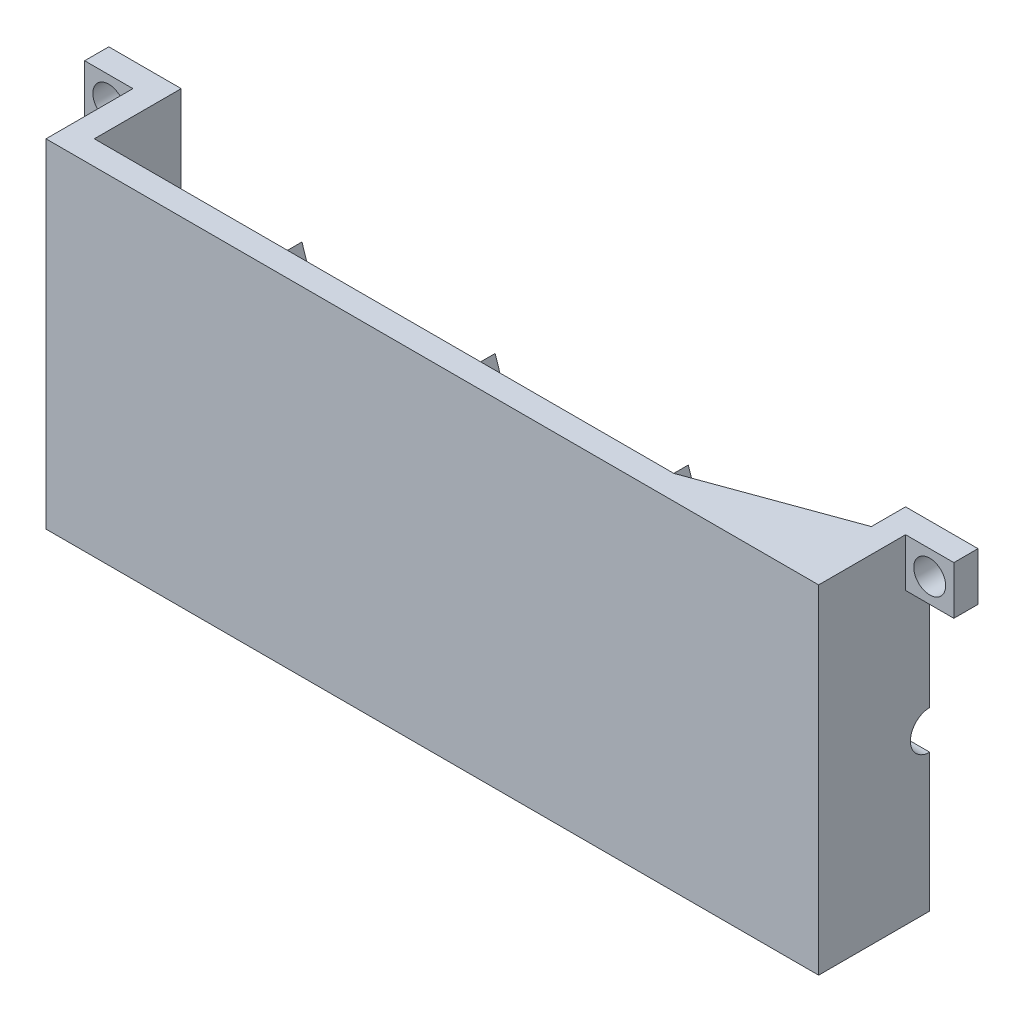
ISO-10303-21;
HEADER;
FILE_DESCRIPTION(('STEP AP214'),'2;1');
FILE_NAME('part.step','',(''),(''),'','','');
FILE_SCHEMA(('AUTOMOTIVE_DESIGN { 1 0 10303 214 1 1 1 1 }'));
ENDSEC;
DATA;
#1=APPLICATION_CONTEXT('core data for automotive mechanical design processes');
#2=APPLICATION_PROTOCOL_DEFINITION('international standard','automotive_design',2000,#1);
#3=PRODUCT_CONTEXT('',#1,'mechanical');
#4=PRODUCT('Part','Part','',(#3));
#5=PRODUCT_RELATED_PRODUCT_CATEGORY('part','',(#4));
#6=PRODUCT_DEFINITION_FORMATION('','',#4);
#7=PRODUCT_DEFINITION_CONTEXT('part definition',#1,'design');
#8=PRODUCT_DEFINITION('design','',#6,#7);
#9=PRODUCT_DEFINITION_SHAPE('','',#8);
#10=(LENGTH_UNIT() NAMED_UNIT(*) SI_UNIT(.MILLI.,.METRE.));
#11=(NAMED_UNIT(*) PLANE_ANGLE_UNIT() SI_UNIT($,.RADIAN.));
#12=(NAMED_UNIT(*) SI_UNIT($,.STERADIAN.) SOLID_ANGLE_UNIT());
#13=UNCERTAINTY_MEASURE_WITH_UNIT(LENGTH_MEASURE(1.E-05),#10,'distance_accuracy_value','');
#14=(GEOMETRIC_REPRESENTATION_CONTEXT(3) GLOBAL_UNCERTAINTY_ASSIGNED_CONTEXT((#13)) GLOBAL_UNIT_ASSIGNED_CONTEXT((#10,
#11,#12)) REPRESENTATION_CONTEXT('',''));
#15=CARTESIAN_POINT('',(0.,0.,0.));
#16=DIRECTION('',(0.,0.,1.));
#17=DIRECTION('',(1.,0.,0.));
#18=AXIS2_PLACEMENT_3D('',#15,#16,#17);
#19=CARTESIAN_POINT('',(0.,0.,63.5515463917525));
#20=DIRECTION('',(0.,0.,-1.));
#21=DIRECTION('',(-1.,0.,0.));
#22=AXIS2_PLACEMENT_3D('',#19,#20,#21);
#23=PLANE('',#22);
#24=DIRECTION('',(0.316227766016838,0.948683298050514,0.));
#25=VECTOR('',#24,1.);
#26=CARTESIAN_POINT('',(-11.6752577319588,5.00000000000001,63.5515463917525));
#27=LINE('',#26,#25);
#28=CARTESIAN_POINT('',(-7.25859106529209,18.25,63.5515463917525));
#29=VERTEX_POINT('',#28);
#30=CARTESIAN_POINT('',(-4.17525773195875,27.5,63.5515463917525));
#31=VERTEX_POINT('',#30);
#32=EDGE_CURVE('E298',#29,#31,#27,.T.);
#33=ORIENTED_EDGE('',*,*,#32,.T.);
#34=DIRECTION('',(0.316227766016838,-0.948683298050514,0.));
#35=VECTOR('',#34,1.);
#36=CARTESIAN_POINT('',(-4.17525773195875,27.5,63.5515463917525));
#37=LINE('',#36,#35);
#38=CARTESIAN_POINT('',(-1.09192439862542,18.25,63.5515463917525));
#39=VERTEX_POINT('',#38);
#40=EDGE_CURVE('E396',#31,#39,#37,.T.);
#41=ORIENTED_EDGE('',*,*,#40,.T.);
#42=DIRECTION('',(-1.,0.,0.));
#43=VECTOR('',#42,1.);
#44=CARTESIAN_POINT('',(45.,18.25,63.5515463917525));
#45=LINE('',#44,#43);
#46=EDGE_CURVE('E390',#29,#39,#45,.F.);
#47=ORIENTED_EDGE('',*,*,#46,.F.);
#48=EDGE_LOOP('',(#33,#41,#47));
#49=FACE_BOUND('',#48,.T.);
#50=ADVANCED_FACE('F34',(#49),#23,.T.);
#51=DIRECTION('',(0.316227766016838,0.948683298050514,0.));
#52=VECTOR('',#51,1.);
#53=CARTESIAN_POINT('',(8.32474226804124,5.00000000000001,63.5515463917525));
#54=LINE('',#53,#52);
#55=CARTESIAN_POINT('',(12.7414089347079,18.25,63.5515463917525));
#56=VERTEX_POINT('',#55);
#57=CARTESIAN_POINT('',(15.8247422680413,27.5,63.5515463917525));
#58=VERTEX_POINT('',#57);
#59=EDGE_CURVE('E403',#56,#58,#54,.T.);
#60=ORIENTED_EDGE('',*,*,#59,.T.);
#61=DIRECTION('',(0.316227766016838,-0.948683298050514,0.));
#62=VECTOR('',#61,1.);
#63=CARTESIAN_POINT('',(15.8247422680413,27.5,63.5515463917525));
#64=LINE('',#63,#62);
#65=CARTESIAN_POINT('',(18.9080756013746,18.25,63.5515463917525));
#66=VERTEX_POINT('',#65);
#67=EDGE_CURVE('E411',#58,#66,#64,.T.);
#68=ORIENTED_EDGE('',*,*,#67,.T.);
#69=DIRECTION('',(-1.,0.,0.));
#70=VECTOR('',#69,1.);
#71=CARTESIAN_POINT('',(45.,18.25,63.5515463917525));
#72=LINE('',#71,#70);
#73=EDGE_CURVE('E460',#56,#66,#72,.F.);
#74=ORIENTED_EDGE('',*,*,#73,.F.);
#75=EDGE_LOOP('',(#60,#68,#74));
#76=FACE_BOUND('',#75,.T.);
#77=ADVANCED_FACE('F640',(#76),#23,.T.);
#78=DIRECTION('',(0.316227766016838,0.948683298050514,0.));
#79=VECTOR('',#78,1.);
#80=CARTESIAN_POINT('',(-31.6752577319588,5.00000000000001,63.5515463917525));
#81=LINE('',#80,#79);
#82=CARTESIAN_POINT('',(-27.2585910652921,18.25,63.5515463917525));
#83=VERTEX_POINT('',#82);
#84=CARTESIAN_POINT('',(-24.1752577319588,27.5,63.5515463917525));
#85=VERTEX_POINT('',#84);
#86=EDGE_CURVE('E412',#83,#85,#81,.T.);
#87=ORIENTED_EDGE('',*,*,#86,.T.);
#88=DIRECTION('',(0.316227766016838,-0.948683298050514,0.));
#89=VECTOR('',#88,1.);
#90=CARTESIAN_POINT('',(-24.1752577319588,27.5,63.5515463917525));
#91=LINE('',#90,#89);
#92=CARTESIAN_POINT('',(-21.0919243986254,18.25,63.5515463917525));
#93=VERTEX_POINT('',#92);
#94=EDGE_CURVE('E419',#85,#93,#91,.T.);
#95=ORIENTED_EDGE('',*,*,#94,.T.);
#96=DIRECTION('',(-1.,0.,0.));
#97=VECTOR('',#96,1.);
#98=CARTESIAN_POINT('',(45.,18.25,63.5515463917525));
#99=LINE('',#98,#97);
#100=EDGE_CURVE('E464',#83,#93,#99,.F.);
#101=ORIENTED_EDGE('',*,*,#100,.F.);
#102=EDGE_LOOP('',(#87,#95,#101));
#103=FACE_BOUND('',#102,.T.);
#104=ADVANCED_FACE('F687',(#103),#23,.T.);
#105=CARTESIAN_POINT('',(-41.6752577319587,32.5,63.5515463917525));
#106=DIRECTION('',(0.,0.,-1.));
#107=DIRECTION('',(-1.,0.,0.));
#108=AXIS2_PLACEMENT_3D('',#105,#106,#107);
#109=CIRCLE('',#108,1.65);
#110=CARTESIAN_POINT('',(-43.3252577319587,32.5,63.5515463917525));
#111=VERTEX_POINT('',#110);
#112=EDGE_CURVE('E299',#111,#111,#109,.F.);
#113=ORIENTED_EDGE('',*,*,#112,.T.);
#114=EDGE_LOOP('',(#113));
#115=FACE_BOUND('',#114,.T.);
#116=DIRECTION('',(0.,1.,0.));
#117=VECTOR('',#116,1.);
#118=CARTESIAN_POINT('',(-39.1752577319587,35.,63.5515463917525));
#119=LINE('',#118,#117);
#120=CARTESIAN_POINT('',(-39.1752577319587,18.25,63.5515463917525));
#121=VERTEX_POINT('',#120);
#122=CARTESIAN_POINT('',(-39.1752577319587,30.,63.5515463917525));
#123=VERTEX_POINT('',#122);
#124=EDGE_CURVE('E279',#121,#123,#119,.T.);
#125=ORIENTED_EDGE('',*,*,#124,.T.);
#126=DIRECTION('',(-1.,0.,0.));
#127=VECTOR('',#126,1.);
#128=CARTESIAN_POINT('',(-44.1752577319587,30.,63.5515463917525));
#129=LINE('',#128,#127);
#130=CARTESIAN_POINT('',(-44.1752577319587,30.,63.5515463917525));
#131=VERTEX_POINT('',#130);
#132=EDGE_CURVE('E289',#123,#131,#129,.T.);
#133=ORIENTED_EDGE('',*,*,#132,.T.);
#134=DIRECTION('',(0.,-1.,0.));
#135=VECTOR('',#134,1.);
#136=CARTESIAN_POINT('',(-44.1752577319587,0.,63.5515463917525));
#137=LINE('',#136,#135);
#138=CARTESIAN_POINT('',(-44.1752577319587,35.,63.5515463917525));
#139=VERTEX_POINT('',#138);
#140=EDGE_CURVE('E447',#139,#131,#137,.T.);
#141=ORIENTED_EDGE('',*,*,#140,.F.);
#142=DIRECTION('',(1.,0.,0.));
#143=VECTOR('',#142,1.);
#144=CARTESIAN_POINT('',(0.,35.,63.5515463917525));
#145=LINE('',#144,#143);
#146=CARTESIAN_POINT('',(-36.6752577319588,35.,63.5515463917525));
#147=VERTEX_POINT('',#146);
#148=EDGE_CURVE('E294',#139,#147,#145,.T.);
#149=ORIENTED_EDGE('',*,*,#148,.T.);
#150=DIRECTION('',(0.,1.,0.));
#151=VECTOR('',#150,1.);
#152=CARTESIAN_POINT('',(-36.6752577319588,5.00000000000001,63.5515463917525));
#153=LINE('',#152,#151);
#154=CARTESIAN_POINT('',(-36.6752577319587,18.25,63.5515463917525));
#155=VERTEX_POINT('',#154);
#156=EDGE_CURVE('E446',#155,#147,#153,.T.);
#157=ORIENTED_EDGE('',*,*,#156,.F.);
#158=DIRECTION('',(-1.,0.,0.));
#159=VECTOR('',#158,1.);
#160=CARTESIAN_POINT('',(45.,18.25,63.5515463917525));
#161=LINE('',#160,#159);
#162=EDGE_CURVE('E292',#121,#155,#161,.F.);
#163=ORIENTED_EDGE('',*,*,#162,.F.);
#164=EDGE_LOOP('',(#125,#133,#141,#149,#157,#163));
#165=FACE_BOUND('',#164,.T.);
#166=ADVANCED_FACE('F288',(#115,#165),#23,.T.);
#167=DIRECTION('',(-1.,0.,0.));
#168=VECTOR('',#167,1.);
#169=CARTESIAN_POINT('',(-36.6752577319588,5.00000000000001,63.5515463917525));
#170=LINE('',#169,#168);
#171=CARTESIAN_POINT('',(-11.6752577319588,5.00000000000001,63.5515463917525));
#172=VERTEX_POINT('',#171);
#173=CARTESIAN_POINT('',(-16.6752577319588,5.00000000000001,63.5515463917525));
#174=VERTEX_POINT('',#173);
#175=EDGE_CURVE('E437',#172,#174,#170,.T.);
#176=ORIENTED_EDGE('',*,*,#175,.F.);
#177=CARTESIAN_POINT('',(-8.59192439862543,14.25,63.5515463917525));
#178=VERTEX_POINT('',#177);
#179=EDGE_CURVE('E302',#172,#178,#27,.T.);
#180=ORIENTED_EDGE('',*,*,#179,.T.);
#181=DIRECTION('',(-1.,0.,0.));
#182=VECTOR('',#181,1.);
#183=CARTESIAN_POINT('',(45.,14.25,63.5515463917525));
#184=LINE('',#183,#182);
#185=CARTESIAN_POINT('',(0.241408934707921,14.25,63.5515463917525));
#186=VERTEX_POINT('',#185);
#187=EDGE_CURVE('E388',#186,#178,#184,.T.);
#188=ORIENTED_EDGE('',*,*,#187,.F.);
#189=CARTESIAN_POINT('',(3.32474226804125,5.00000000000001,63.5515463917525));
#190=VERTEX_POINT('',#189);
#191=EDGE_CURVE('E398',#186,#190,#37,.T.);
#192=ORIENTED_EDGE('',*,*,#191,.T.);
#193=DIRECTION('',(-1.,0.,0.));
#194=VECTOR('',#193,1.);
#195=CARTESIAN_POINT('',(-36.6752577319588,5.00000000000001,63.5515463917525));
#196=LINE('',#195,#194);
#197=CARTESIAN_POINT('',(8.32474226804124,5.00000000000001,63.5515463917525));
#198=VERTEX_POINT('',#197);
#199=EDGE_CURVE('E435',#198,#190,#196,.T.);
#200=ORIENTED_EDGE('',*,*,#199,.F.);
#201=CARTESIAN_POINT('',(11.4080756013746,14.25,63.5515463917525));
#202=VERTEX_POINT('',#201);
#203=EDGE_CURVE('E407',#198,#202,#54,.T.);
#204=ORIENTED_EDGE('',*,*,#203,.T.);
#205=DIRECTION('',(-1.,0.,0.));
#206=VECTOR('',#205,1.);
#207=CARTESIAN_POINT('',(45.,14.25,63.5515463917525));
#208=LINE('',#207,#206);
#209=CARTESIAN_POINT('',(20.2414089347079,14.25,63.5515463917525));
#210=VERTEX_POINT('',#209);
#211=EDGE_CURVE('E458',#210,#202,#208,.T.);
#212=ORIENTED_EDGE('',*,*,#211,.F.);
#213=CARTESIAN_POINT('',(23.3247422680412,5.00000000000001,63.5515463917525));
#214=VERTEX_POINT('',#213);
#215=EDGE_CURVE('E408',#210,#214,#64,.T.);
#216=ORIENTED_EDGE('',*,*,#215,.T.);
#217=DIRECTION('',(-1.,0.,0.));
#218=VECTOR('',#217,1.);
#219=CARTESIAN_POINT('',(-36.6752577319588,5.00000000000001,63.5515463917525));
#220=LINE('',#219,#218);
#221=CARTESIAN_POINT('',(38.3247422680412,5.00000000000001,63.5515463917525));
#222=VERTEX_POINT('',#221);
#223=EDGE_CURVE('E429',#222,#214,#220,.T.);
#224=ORIENTED_EDGE('',*,*,#223,.F.);
#225=DIRECTION('',(0.,-1.,0.));
#226=VECTOR('',#225,1.);
#227=CARTESIAN_POINT('',(38.3247422680412,5.00000000000001,63.5515463917525));
#228=LINE('',#227,#226);
#229=CARTESIAN_POINT('',(38.3247422680412,14.25,63.5515463917525));
#230=VERTEX_POINT('',#229);
#231=EDGE_CURVE('E434',#230,#222,#228,.T.);
#232=ORIENTED_EDGE('',*,*,#231,.F.);
#233=DIRECTION('',(-1.,0.,0.));
#234=VECTOR('',#233,1.);
#235=CARTESIAN_POINT('',(45.,14.25,63.5515463917525));
#236=LINE('',#235,#234);
#237=CARTESIAN_POINT('',(40.8247422680413,14.25,63.5515463917525));
#238=VERTEX_POINT('',#237);
#239=EDGE_CURVE('E469',#238,#230,#236,.T.);
#240=ORIENTED_EDGE('',*,*,#239,.F.);
#241=DIRECTION('',(0.,1.,0.));
#242=VECTOR('',#241,1.);
#243=CARTESIAN_POINT('',(40.8247422680413,35.,63.5515463917525));
#244=LINE('',#243,#242);
#245=CARTESIAN_POINT('',(40.8247422680413,0.,63.5515463917525));
#246=VERTEX_POINT('',#245);
#247=EDGE_CURVE('E423',#246,#238,#244,.T.);
#248=ORIENTED_EDGE('',*,*,#247,.F.);
#249=DIRECTION('',(1.,0.,0.));
#250=VECTOR('',#249,1.);
#251=CARTESIAN_POINT('',(0.,0.,63.5515463917525));
#252=LINE('',#251,#250);
#253=CARTESIAN_POINT('',(-39.1752577319587,0.,63.5515463917525));
#254=VERTEX_POINT('',#253);
#255=EDGE_CURVE('E427',#254,#246,#252,.T.);
#256=ORIENTED_EDGE('',*,*,#255,.F.);
#257=CARTESIAN_POINT('',(-39.1752577319587,14.25,63.5515463917525));
#258=VERTEX_POINT('',#257);
#259=EDGE_CURVE('E293',#254,#258,#119,.T.);
#260=ORIENTED_EDGE('',*,*,#259,.T.);
#261=DIRECTION('',(-1.,0.,0.));
#262=VECTOR('',#261,1.);
#263=CARTESIAN_POINT('',(45.,14.25,63.5515463917525));
#264=LINE('',#263,#262);
#265=CARTESIAN_POINT('',(-36.6752577319587,14.25,63.5515463917525));
#266=VERTEX_POINT('',#265);
#267=EDGE_CURVE('E466',#266,#258,#264,.T.);
#268=ORIENTED_EDGE('',*,*,#267,.F.);
#269=CARTESIAN_POINT('',(-36.6752577319588,5.00000000000001,63.5515463917525));
#270=VERTEX_POINT('',#269);
#271=EDGE_CURVE('E443',#270,#266,#153,.T.);
#272=ORIENTED_EDGE('',*,*,#271,.F.);
#273=DIRECTION('',(-1.,0.,0.));
#274=VECTOR('',#273,1.);
#275=CARTESIAN_POINT('',(-36.6752577319588,5.00000000000001,63.5515463917525));
#276=LINE('',#275,#274);
#277=CARTESIAN_POINT('',(-31.6752577319588,5.00000000000001,63.5515463917525));
#278=VERTEX_POINT('',#277);
#279=EDGE_CURVE('E440',#278,#270,#276,.T.);
#280=ORIENTED_EDGE('',*,*,#279,.F.);
#281=CARTESIAN_POINT('',(-28.5919243986254,14.25,63.5515463917525));
#282=VERTEX_POINT('',#281);
#283=EDGE_CURVE('E415',#278,#282,#81,.T.);
#284=ORIENTED_EDGE('',*,*,#283,.T.);
#285=DIRECTION('',(-1.,0.,0.));
#286=VECTOR('',#285,1.);
#287=CARTESIAN_POINT('',(45.,14.25,63.5515463917525));
#288=LINE('',#287,#286);
#289=CARTESIAN_POINT('',(-19.7585910652921,14.25,63.5515463917525));
#290=VERTEX_POINT('',#289);
#291=EDGE_CURVE('E462',#290,#282,#288,.T.);
#292=ORIENTED_EDGE('',*,*,#291,.F.);
#293=EDGE_CURVE('E416',#290,#174,#91,.T.);
#294=ORIENTED_EDGE('',*,*,#293,.T.);
#295=EDGE_LOOP('',(#176,#180,#188,#192,#200,#204,#212,#216,#224,#232,#240,#248,#256,#260,#268,
#272,#280,#284,#292,#294));
#296=FACE_BOUND('',#295,.T.);
#297=ADVANCED_FACE('F544',(#296),#23,.T.);
#298=DIRECTION('',(1.,0.,0.));
#299=VECTOR('',#298,1.);
#300=CARTESIAN_POINT('',(45.8247422680413,30.,63.5515463917525));
#301=LINE('',#300,#299);
#302=CARTESIAN_POINT('',(40.8247422680413,30.,63.5515463917525));
#303=VERTEX_POINT('',#302);
#304=CARTESIAN_POINT('',(45.8247422680413,30.,63.5515463917525));
#305=VERTEX_POINT('',#304);
#306=EDGE_CURVE('E449',#303,#305,#301,.T.);
#307=ORIENTED_EDGE('',*,*,#306,.F.);
#308=CARTESIAN_POINT('',(40.8247422680413,18.25,63.5515463917525));
#309=VERTEX_POINT('',#308);
#310=EDGE_CURVE('E426',#309,#303,#244,.T.);
#311=ORIENTED_EDGE('',*,*,#310,.F.);
#312=DIRECTION('',(-1.,0.,0.));
#313=VECTOR('',#312,1.);
#314=CARTESIAN_POINT('',(45.,18.25,63.5515463917525));
#315=LINE('',#314,#313);
#316=CARTESIAN_POINT('',(38.3247422680412,18.25,63.5515463917525));
#317=VERTEX_POINT('',#316);
#318=EDGE_CURVE('E471',#317,#309,#315,.F.);
#319=ORIENTED_EDGE('',*,*,#318,.F.);
#320=CARTESIAN_POINT('',(38.3247422680412,35.,63.5515463917525));
#321=VERTEX_POINT('',#320);
#322=EDGE_CURVE('E431',#321,#317,#228,.T.);
#323=ORIENTED_EDGE('',*,*,#322,.F.);
#324=CARTESIAN_POINT('',(45.8247422680413,35.,63.5515463917525));
#325=VERTEX_POINT('',#324);
#326=EDGE_CURVE('E420',#321,#325,#145,.T.);
#327=ORIENTED_EDGE('',*,*,#326,.T.);
#328=DIRECTION('',(0.,1.,0.));
#329=VECTOR('',#328,1.);
#330=CARTESIAN_POINT('',(45.8247422680413,0.,63.5515463917525));
#331=LINE('',#330,#329);
#332=EDGE_CURVE('E451',#305,#325,#331,.T.);
#333=ORIENTED_EDGE('',*,*,#332,.F.);
#334=EDGE_LOOP('',(#307,#311,#319,#323,#327,#333));
#335=FACE_BOUND('',#334,.T.);
#336=CARTESIAN_POINT('',(43.3247422680413,32.5,63.5515463917525));
#337=DIRECTION('',(0.,0.,-1.));
#338=DIRECTION('',(-1.,0.,0.));
#339=AXIS2_PLACEMENT_3D('',#336,#337,#338);
#340=CIRCLE('',#339,1.65);
#341=CARTESIAN_POINT('',(41.6747422680413,32.5,63.5515463917525));
#342=VERTEX_POINT('',#341);
#343=EDGE_CURVE('E453',#342,#342,#340,.T.);
#344=ORIENTED_EDGE('',*,*,#343,.F.);
#345=EDGE_LOOP('',(#344));
#346=FACE_BOUND('',#345,.T.);
#347=ADVANCED_FACE('F552',(#335,#346),#23,.T.);
#348=CARTESIAN_POINT('',(-39.1752577319587,35.,75.0515463917525));
#349=DIRECTION('',(0.,0.,-1.));
#350=DIRECTION('',(-1.,0.,0.));
#351=AXIS2_PLACEMENT_3D('',#348,#349,#350);
#352=PLANE('',#351);
#353=DIRECTION('',(1.,0.,0.));
#354=VECTOR('',#353,1.);
#355=CARTESIAN_POINT('',(-39.1752577319587,0.,75.0515463917525));
#356=LINE('',#355,#354);
#357=CARTESIAN_POINT('',(-39.1752577319587,0.,75.0515463917525));
#358=VERTEX_POINT('',#357);
#359=CARTESIAN_POINT('',(40.8247422680413,0.,75.0515463917525));
#360=VERTEX_POINT('',#359);
#361=EDGE_CURVE('E316',#358,#360,#356,.T.);
#362=ORIENTED_EDGE('',*,*,#361,.T.);
#363=DIRECTION('',(0.,-1.,0.));
#364=VECTOR('',#363,1.);
#365=CARTESIAN_POINT('',(40.8247422680413,35.,75.0515463917525));
#366=LINE('',#365,#364);
#367=CARTESIAN_POINT('',(40.8247422680413,35.,75.0515463917525));
#368=VERTEX_POINT('',#367);
#369=EDGE_CURVE('E311',#368,#360,#366,.T.);
#370=ORIENTED_EDGE('',*,*,#369,.F.);
#371=DIRECTION('',(1.,0.,0.));
#372=VECTOR('',#371,1.);
#373=CARTESIAN_POINT('',(-39.1752577319587,35.,75.0515463917525));
#374=LINE('',#373,#372);
#375=CARTESIAN_POINT('',(-39.1752577319587,35.,75.0515463917525));
#376=VERTEX_POINT('',#375);
#377=EDGE_CURVE('E310',#376,#368,#374,.T.);
#378=ORIENTED_EDGE('',*,*,#377,.F.);
#379=DIRECTION('',(0.,-1.,0.));
#380=VECTOR('',#379,1.);
#381=CARTESIAN_POINT('',(-39.1752577319587,35.,75.0515463917525));
#382=LINE('',#381,#380);
#383=EDGE_CURVE('E473',#376,#358,#382,.T.);
#384=ORIENTED_EDGE('',*,*,#383,.T.);
#385=EDGE_LOOP('',(#362,#370,#378,#384));
#386=FACE_BOUND('',#385,.T.);
#387=ADVANCED_FACE('F536',(#386),#352,.F.);
#388=CARTESIAN_POINT('',(23.3247422680412,50.9626665871387,72.5515463917525));
#389=DIRECTION('',(0.342020143325663,0.,0.93969262078591));
#390=DIRECTION('',(0.93969262078591,0.,-0.342020143325663));
#391=AXIS2_PLACEMENT_3D('',#388,#389,#390);
#392=PLANE('',#391);
#393=DIRECTION('',(0.,-1.,0.));
#394=VECTOR('',#393,1.);
#395=CARTESIAN_POINT('',(23.3247422680412,50.9626665871387,72.5515463917525));
#396=LINE('',#395,#394);
#397=CARTESIAN_POINT('',(23.3247422680412,35.,72.5515463917525));
#398=VERTEX_POINT('',#397);
#399=CARTESIAN_POINT('',(23.3247422680412,5.00000000000001,72.5515463917525));
#400=VERTEX_POINT('',#399);
#401=EDGE_CURVE('E493',#398,#400,#396,.T.);
#402=ORIENTED_EDGE('',*,*,#401,.F.);
#403=DIRECTION('',(0.93969262078591,0.,-0.342020143325663));
#404=VECTOR('',#403,1.);
#405=CARTESIAN_POINT('',(23.3247422680412,35.,72.5515463917525));
#406=LINE('',#405,#404);
#407=CARTESIAN_POINT('',(38.3247422680412,35.,67.0919928777596));
#408=VERTEX_POINT('',#407);
#409=EDGE_CURVE('E498',#398,#408,#406,.T.);
#410=ORIENTED_EDGE('',*,*,#409,.T.);
#411=DIRECTION('',(0.,-1.,0.));
#412=VECTOR('',#411,1.);
#413=CARTESIAN_POINT('',(38.3247422680412,50.9626665871387,67.0919928777596));
#414=LINE('',#413,#412);
#415=CARTESIAN_POINT('',(38.3247422680412,5.00000000000001,67.0919928777596));
#416=VERTEX_POINT('',#415);
#417=EDGE_CURVE('E495',#408,#416,#414,.T.);
#418=ORIENTED_EDGE('',*,*,#417,.T.);
#419=DIRECTION('',(-0.93969262078591,0.,0.342020143325663));
#420=VECTOR('',#419,1.);
#421=CARTESIAN_POINT('',(23.3247422680412,5.00000000000001,72.5515463917525));
#422=LINE('',#421,#420);
#423=EDGE_CURVE('E490',#416,#400,#422,.T.);
#424=ORIENTED_EDGE('',*,*,#423,.T.);
#425=EDGE_LOOP('',(#402,#410,#418,#424));
#426=FACE_BOUND('',#425,.T.);
#427=ADVANCED_FACE('F581',(#426),#392,.F.);
#428=CARTESIAN_POINT('',(-36.6752577319588,5.00000000000001,60.5515463917525));
#429=DIRECTION('',(0.,1.,0.));
#430=DIRECTION('',(1.,0.,0.));
#431=AXIS2_PLACEMENT_3D('',#428,#429,#430);
#432=PLANE('',#431);
#433=DIRECTION('',(0.,0.,1.));
#434=VECTOR('',#433,1.);
#435=CARTESIAN_POINT('',(38.3247422680412,5.00000000000001,60.5515463917525));
#436=LINE('',#435,#434);
#437=EDGE_CURVE('E324',#222,#416,#436,.T.);
#438=ORIENTED_EDGE('',*,*,#437,.F.);
#439=ORIENTED_EDGE('',*,*,#223,.T.);
#440=DIRECTION('',(0.,0.,1.));
#441=VECTOR('',#440,1.);
#442=CARTESIAN_POINT('',(23.3247422680412,5.00000000000001,33.5099118257726));
#443=LINE('',#442,#441);
#444=EDGE_CURVE('E89',#214,#400,#443,.T.);
#445=ORIENTED_EDGE('',*,*,#444,.T.);
#446=ORIENTED_EDGE('',*,*,#423,.F.);
#447=EDGE_LOOP('',(#438,#439,#445,#446));
#448=FACE_BOUND('',#447,.T.);
#449=ADVANCED_FACE('F603',(#448),#432,.T.);
#450=DIRECTION('',(0.,0.,1.));
#451=VECTOR('',#450,1.);
#452=CARTESIAN_POINT('',(8.32474226804124,5.00000000000001,33.5099118257726));
#453=LINE('',#452,#451);
#454=CARTESIAN_POINT('',(8.32474226804124,5.00000000000001,72.5515463917525));
#455=VERTEX_POINT('',#454);
#456=EDGE_CURVE('E343',#198,#455,#453,.T.);
#457=ORIENTED_EDGE('',*,*,#456,.F.);
#458=ORIENTED_EDGE('',*,*,#199,.T.);
#459=DIRECTION('',(0.,0.,1.));
#460=VECTOR('',#459,1.);
#461=CARTESIAN_POINT('',(3.32474226804125,5.00000000000001,33.5099118257726));
#462=LINE('',#461,#460);
#463=CARTESIAN_POINT('',(3.32474226804125,5.00000000000001,72.5515463917525));
#464=VERTEX_POINT('',#463);
#465=EDGE_CURVE('E340',#190,#464,#462,.T.);
#466=ORIENTED_EDGE('',*,*,#465,.T.);
#467=DIRECTION('',(-1.,0.,0.));
#468=VECTOR('',#467,1.);
#469=CARTESIAN_POINT('',(-36.6752577319588,5.00000000000001,72.5515463917525));
#470=LINE('',#469,#468);
#471=EDGE_CURVE('E516',#455,#464,#470,.T.);
#472=ORIENTED_EDGE('',*,*,#471,.F.);
#473=EDGE_LOOP('',(#457,#458,#466,#472));
#474=FACE_BOUND('',#473,.T.);
#475=ADVANCED_FACE('F594',(#474),#432,.T.);
#476=CARTESIAN_POINT('',(-36.6752577319588,5.00000000000001,72.5515463917525));
#477=DIRECTION('',(0.,0.,1.));
#478=DIRECTION('',(1.,0.,0.));
#479=AXIS2_PLACEMENT_3D('',#476,#477,#478);
#480=PLANE('',#479);
#481=DIRECTION('',(0.316227766016838,-0.948683298050514,0.));
#482=VECTOR('',#481,1.);
#483=CARTESIAN_POINT('',(15.8247422680413,27.5,72.5515463917525));
#484=LINE('',#483,#482);
#485=CARTESIAN_POINT('',(15.8247422680413,27.5,72.5515463917525));
#486=VERTEX_POINT('',#485);
#487=EDGE_CURVE('E349',#486,#400,#484,.T.);
#488=ORIENTED_EDGE('',*,*,#487,.F.);
#489=DIRECTION('',(0.316227766016838,0.948683298050514,0.));
#490=VECTOR('',#489,1.);
#491=CARTESIAN_POINT('',(8.32474226804124,5.00000000000001,72.5515463917525));
#492=LINE('',#491,#490);
#493=EDGE_CURVE('E501',#455,#486,#492,.T.);
#494=ORIENTED_EDGE('',*,*,#493,.F.);
#495=ORIENTED_EDGE('',*,*,#471,.T.);
#496=DIRECTION('',(0.316227766016838,-0.948683298050514,0.));
#497=VECTOR('',#496,1.);
#498=CARTESIAN_POINT('',(-4.17525773195875,27.5,72.5515463917525));
#499=LINE('',#498,#497);
#500=CARTESIAN_POINT('',(-4.17525773195875,27.5,72.5515463917525));
#501=VERTEX_POINT('',#500);
#502=EDGE_CURVE('E342',#501,#464,#499,.T.);
#503=ORIENTED_EDGE('',*,*,#502,.F.);
#504=DIRECTION('',(0.316227766016838,0.948683298050514,0.));
#505=VECTOR('',#504,1.);
#506=CARTESIAN_POINT('',(-11.6752577319588,5.00000000000001,72.5515463917525));
#507=LINE('',#506,#505);
#508=CARTESIAN_POINT('',(-11.6752577319588,5.00000000000001,72.5515463917525));
#509=VERTEX_POINT('',#508);
#510=EDGE_CURVE('E346',#509,#501,#507,.T.);
#511=ORIENTED_EDGE('',*,*,#510,.F.);
#512=CARTESIAN_POINT('',(-16.6752577319588,5.00000000000001,72.5515463917525));
#513=VERTEX_POINT('',#512);
#514=EDGE_CURVE('E513',#509,#513,#470,.T.);
#515=ORIENTED_EDGE('',*,*,#514,.T.);
#516=DIRECTION('',(0.316227766016838,-0.948683298050514,0.));
#517=VECTOR('',#516,1.);
#518=CARTESIAN_POINT('',(-24.1752577319588,27.5,72.5515463917525));
#519=LINE('',#518,#517);
#520=CARTESIAN_POINT('',(-24.1752577319588,27.5,72.5515463917525));
#521=VERTEX_POINT('',#520);
#522=EDGE_CURVE('E334',#521,#513,#519,.T.);
#523=ORIENTED_EDGE('',*,*,#522,.F.);
#524=DIRECTION('',(0.316227766016838,0.948683298050514,0.));
#525=VECTOR('',#524,1.);
#526=CARTESIAN_POINT('',(-31.6752577319588,5.00000000000001,72.5515463917525));
#527=LINE('',#526,#525);
#528=CARTESIAN_POINT('',(-31.6752577319588,5.00000000000001,72.5515463917525));
#529=VERTEX_POINT('',#528);
#530=EDGE_CURVE('E338',#529,#521,#527,.T.);
#531=ORIENTED_EDGE('',*,*,#530,.F.);
#532=CARTESIAN_POINT('',(-36.6752577319588,5.00000000000001,72.5515463917525));
#533=VERTEX_POINT('',#532);
#534=EDGE_CURVE('E330',#529,#533,#470,.T.);
#535=ORIENTED_EDGE('',*,*,#534,.T.);
#536=DIRECTION('',(0.,1.,0.));
#537=VECTOR('',#536,1.);
#538=CARTESIAN_POINT('',(-36.6752577319588,5.00000000000001,72.5515463917525));
#539=LINE('',#538,#537);
#540=CARTESIAN_POINT('',(-36.6752577319588,35.,72.5515463917525));
#541=VERTEX_POINT('',#540);
#542=EDGE_CURVE('E517',#533,#541,#539,.T.);
#543=ORIENTED_EDGE('',*,*,#542,.T.);
#544=DIRECTION('',(1.,0.,0.));
#545=VECTOR('',#544,1.);
#546=CARTESIAN_POINT('',(-36.6752577319588,35.,72.5515463917525));
#547=LINE('',#546,#545);
#548=EDGE_CURVE('E326',#541,#398,#547,.T.);
#549=ORIENTED_EDGE('',*,*,#548,.T.);
#550=ORIENTED_EDGE('',*,*,#401,.T.);
#551=EDGE_LOOP('',(#488,#494,#495,#503,#511,#515,#523,#531,#535,#543,#549,#550));
#552=FACE_BOUND('',#551,.T.);
#553=ADVANCED_FACE('F577',(#552),#480,.F.);
#554=DIRECTION('',(0.,0.,1.));
#555=VECTOR('',#554,1.);
#556=CARTESIAN_POINT('',(-11.6752577319588,5.00000000000001,33.5099118257726));
#557=LINE('',#556,#555);
#558=EDGE_CURVE('E335',#172,#509,#557,.T.);
#559=ORIENTED_EDGE('',*,*,#558,.F.);
#560=ORIENTED_EDGE('',*,*,#175,.T.);
#561=DIRECTION('',(0.,0.,1.));
#562=VECTOR('',#561,1.);
#563=CARTESIAN_POINT('',(-16.6752577319588,5.00000000000001,33.5099118257726));
#564=LINE('',#563,#562);
#565=EDGE_CURVE('E332',#174,#513,#564,.T.);
#566=ORIENTED_EDGE('',*,*,#565,.T.);
#567=ORIENTED_EDGE('',*,*,#514,.F.);
#568=EDGE_LOOP('',(#559,#560,#566,#567));
#569=FACE_BOUND('',#568,.T.);
#570=ADVANCED_FACE('F628',(#569),#432,.T.);
#571=CARTESIAN_POINT('',(-11.6752577319588,5.00000000000001,33.5099118257726));
#572=DIRECTION('',(0.948683298050514,-0.316227766016838,0.));
#573=DIRECTION('',(-0.316227766016838,-0.948683298050514,0.));
#574=AXIS2_PLACEMENT_3D('',#571,#572,#573);
#575=PLANE('',#574);
#576=ORIENTED_EDGE('',*,*,#179,.F.);
#577=ORIENTED_EDGE('',*,*,#558,.T.);
#578=ORIENTED_EDGE('',*,*,#510,.T.);
#579=DIRECTION('',(0.,0.,1.));
#580=VECTOR('',#579,1.);
#581=CARTESIAN_POINT('',(-4.17525773195875,27.5,33.5099118257726));
#582=LINE('',#581,#580);
#583=EDGE_CURVE('E337',#31,#501,#582,.T.);
#584=ORIENTED_EDGE('',*,*,#583,.F.);
#585=ORIENTED_EDGE('',*,*,#32,.F.);
#586=CARTESIAN_POINT('',(-7.92525773195876,16.25,63.5515463917525));
#587=DIRECTION('',(0.948683298050514,-0.316227766016838,0.));
#588=DIRECTION('',(-0.316227766016838,-0.948683298050514,0.));
#589=AXIS2_PLACEMENT_3D('',#586,#587,#588);
#590=ELLIPSE('',#589,2.10818510677892,2.);
#591=EDGE_CURVE('E11',#178,#29,#590,.F.);
#592=ORIENTED_EDGE('',*,*,#591,.F.);
#593=EDGE_LOOP('',(#576,#577,#578,#584,#585,#592));
#594=FACE_BOUND('',#593,.T.);
#595=ADVANCED_FACE('F672',(#594),#575,.F.);
#596=CARTESIAN_POINT('',(-4.17525773195875,27.5,33.5099118257726));
#597=DIRECTION('',(-0.948683298050514,-0.316227766016838,0.));
#598=DIRECTION('',(-0.316227766016838,0.948683298050514,0.));
#599=AXIS2_PLACEMENT_3D('',#596,#597,#598);
#600=PLANE('',#599);
#601=ORIENTED_EDGE('',*,*,#40,.F.);
#602=ORIENTED_EDGE('',*,*,#583,.T.);
#603=ORIENTED_EDGE('',*,*,#502,.T.);
#604=ORIENTED_EDGE('',*,*,#465,.F.);
#605=ORIENTED_EDGE('',*,*,#191,.F.);
#606=CARTESIAN_POINT('',(-0.425257731958749,16.25,63.5515463917525));
#607=DIRECTION('',(-0.948683298050514,-0.316227766016838,0.));
#608=DIRECTION('',(-0.316227766016838,0.948683298050514,0.));
#609=AXIS2_PLACEMENT_3D('',#606,#607,#608);
#610=ELLIPSE('',#609,2.10818510677892,2.);
#611=EDGE_CURVE('E43',#39,#186,#610,.F.);
#612=ORIENTED_EDGE('',*,*,#611,.F.);
#613=EDGE_LOOP('',(#601,#602,#603,#604,#605,#612));
#614=FACE_BOUND('',#613,.T.);
#615=ADVANCED_FACE('F395',(#614),#600,.F.);
#616=CARTESIAN_POINT('',(45.,16.25,63.5515463917525));
#617=DIRECTION('',(-1.,0.,0.));
#618=DIRECTION('',(0.,0.,1.));
#619=AXIS2_PLACEMENT_3D('',#616,#617,#618);
#620=CYLINDRICAL_SURFACE('',#619,2.);
#621=ORIENTED_EDGE('',*,*,#611,.T.);
#622=ORIENTED_EDGE('',*,*,#187,.T.);
#623=ORIENTED_EDGE('',*,*,#591,.T.);
#624=ORIENTED_EDGE('',*,*,#46,.T.);
#625=EDGE_LOOP('',(#621,#622,#623,#624));
#626=FACE_BOUND('',#625,.T.);
#627=ADVANCED_FACE('F36',(#626),#620,.F.);
#628=CARTESIAN_POINT('',(8.32474226804124,5.00000000000001,33.5099118257726));
#629=DIRECTION('',(0.948683298050514,-0.316227766016838,0.));
#630=DIRECTION('',(-0.316227766016838,-0.948683298050514,0.));
#631=AXIS2_PLACEMENT_3D('',#628,#629,#630);
#632=PLANE('',#631);
#633=ORIENTED_EDGE('',*,*,#203,.F.);
#634=ORIENTED_EDGE('',*,*,#456,.T.);
#635=ORIENTED_EDGE('',*,*,#493,.T.);
#636=DIRECTION('',(0.,0.,1.));
#637=VECTOR('',#636,1.);
#638=CARTESIAN_POINT('',(15.8247422680413,27.5,33.5099118257726));
#639=LINE('',#638,#637);
#640=EDGE_CURVE('E345',#58,#486,#639,.T.);
#641=ORIENTED_EDGE('',*,*,#640,.F.);
#642=ORIENTED_EDGE('',*,*,#59,.F.);
#643=CARTESIAN_POINT('',(12.0747422680412,16.25,63.5515463917525));
#644=DIRECTION('',(0.948683298050514,-0.316227766016838,0.));
#645=DIRECTION('',(-0.316227766016838,-0.948683298050514,0.));
#646=AXIS2_PLACEMENT_3D('',#643,#644,#645);
#647=ELLIPSE('',#646,2.10818510677892,2.);
#648=EDGE_CURVE('E383',#202,#56,#647,.F.);
#649=ORIENTED_EDGE('',*,*,#648,.F.);
#650=EDGE_LOOP('',(#633,#634,#635,#641,#642,#649));
#651=FACE_BOUND('',#650,.T.);
#652=ADVANCED_FACE('F588',(#651),#632,.F.);
#653=CARTESIAN_POINT('',(15.8247422680413,27.5,33.5099118257726));
#654=DIRECTION('',(-0.948683298050514,-0.316227766016838,0.));
#655=DIRECTION('',(-0.316227766016838,0.948683298050514,0.));
#656=AXIS2_PLACEMENT_3D('',#653,#654,#655);
#657=PLANE('',#656);
#658=ORIENTED_EDGE('',*,*,#67,.F.);
#659=ORIENTED_EDGE('',*,*,#640,.T.);
#660=ORIENTED_EDGE('',*,*,#487,.T.);
#661=ORIENTED_EDGE('',*,*,#444,.F.);
#662=ORIENTED_EDGE('',*,*,#215,.F.);
#663=CARTESIAN_POINT('',(19.5747422680413,16.25,63.5515463917525));
#664=DIRECTION('',(-0.948683298050514,-0.316227766016838,0.));
#665=DIRECTION('',(-0.316227766016838,0.948683298050514,0.));
#666=AXIS2_PLACEMENT_3D('',#663,#664,#665);
#667=ELLIPSE('',#666,2.10818510677892,2.);
#668=EDGE_CURVE('E380',#66,#210,#667,.F.);
#669=ORIENTED_EDGE('',*,*,#668,.F.);
#670=EDGE_LOOP('',(#658,#659,#660,#661,#662,#669));
#671=FACE_BOUND('',#670,.T.);
#672=ADVANCED_FACE('F600',(#671),#657,.F.);
#673=ORIENTED_EDGE('',*,*,#668,.T.);
#674=ORIENTED_EDGE('',*,*,#211,.T.);
#675=ORIENTED_EDGE('',*,*,#648,.T.);
#676=ORIENTED_EDGE('',*,*,#73,.T.);
#677=EDGE_LOOP('',(#673,#674,#675,#676));
#678=FACE_BOUND('',#677,.T.);
#679=ADVANCED_FACE('F597',(#678),#620,.F.);
#680=DIRECTION('',(0.,0.,1.));
#681=VECTOR('',#680,1.);
#682=CARTESIAN_POINT('',(-31.6752577319588,5.00000000000001,33.5099118257726));
#683=LINE('',#682,#681);
#684=EDGE_CURVE('E327',#278,#529,#683,.T.);
#685=ORIENTED_EDGE('',*,*,#684,.F.);
#686=ORIENTED_EDGE('',*,*,#279,.T.);
#687=DIRECTION('',(0.,0.,1.));
#688=VECTOR('',#687,1.);
#689=CARTESIAN_POINT('',(-36.6752577319588,5.00000000000001,60.5515463917525));
#690=LINE('',#689,#688);
#691=EDGE_CURVE('E319',#270,#533,#690,.T.);
#692=ORIENTED_EDGE('',*,*,#691,.T.);
#693=ORIENTED_EDGE('',*,*,#534,.F.);
#694=EDGE_LOOP('',(#685,#686,#692,#693));
#695=FACE_BOUND('',#694,.T.);
#696=ADVANCED_FACE('F653',(#695),#432,.T.);
#697=CARTESIAN_POINT('',(-31.6752577319588,5.00000000000001,33.5099118257726));
#698=DIRECTION('',(0.948683298050514,-0.316227766016838,0.));
#699=DIRECTION('',(-0.316227766016838,-0.948683298050514,0.));
#700=AXIS2_PLACEMENT_3D('',#697,#698,#699);
#701=PLANE('',#700);
#702=ORIENTED_EDGE('',*,*,#283,.F.);
#703=ORIENTED_EDGE('',*,*,#684,.T.);
#704=ORIENTED_EDGE('',*,*,#530,.T.);
#705=DIRECTION('',(0.,0.,1.));
#706=VECTOR('',#705,1.);
#707=CARTESIAN_POINT('',(-24.1752577319588,27.5,33.5099118257726));
#708=LINE('',#707,#706);
#709=EDGE_CURVE('E329',#85,#521,#708,.T.);
#710=ORIENTED_EDGE('',*,*,#709,.F.);
#711=ORIENTED_EDGE('',*,*,#86,.F.);
#712=CARTESIAN_POINT('',(-27.9252577319588,16.25,63.5515463917525));
#713=DIRECTION('',(0.948683298050514,-0.316227766016838,0.));
#714=DIRECTION('',(-0.316227766016838,-0.948683298050514,0.));
#715=AXIS2_PLACEMENT_3D('',#712,#713,#714);
#716=ELLIPSE('',#715,2.10818510677892,2.);
#717=EDGE_CURVE('E377',#282,#83,#716,.F.);
#718=ORIENTED_EDGE('',*,*,#717,.F.);
#719=EDGE_LOOP('',(#702,#703,#704,#710,#711,#718));
#720=FACE_BOUND('',#719,.T.);
#721=ADVANCED_FACE('F661',(#720),#701,.F.);
#722=CARTESIAN_POINT('',(-24.1752577319588,27.5,33.5099118257726));
#723=DIRECTION('',(-0.948683298050514,-0.316227766016838,0.));
#724=DIRECTION('',(-0.316227766016838,0.948683298050514,0.));
#725=AXIS2_PLACEMENT_3D('',#722,#723,#724);
#726=PLANE('',#725);
#727=ORIENTED_EDGE('',*,*,#94,.F.);
#728=ORIENTED_EDGE('',*,*,#709,.T.);
#729=ORIENTED_EDGE('',*,*,#522,.T.);
#730=ORIENTED_EDGE('',*,*,#565,.F.);
#731=ORIENTED_EDGE('',*,*,#293,.F.);
#732=CARTESIAN_POINT('',(-20.4252577319587,16.25,63.5515463917525));
#733=DIRECTION('',(-0.948683298050514,-0.316227766016838,0.));
#734=DIRECTION('',(-0.316227766016838,0.948683298050514,0.));
#735=AXIS2_PLACEMENT_3D('',#732,#733,#734);
#736=ELLIPSE('',#735,2.10818510677892,2.);
#737=EDGE_CURVE('E374',#93,#290,#736,.F.);
#738=ORIENTED_EDGE('',*,*,#737,.F.);
#739=EDGE_LOOP('',(#727,#728,#729,#730,#731,#738));
#740=FACE_BOUND('',#739,.T.);
#741=ADVANCED_FACE('F658',(#740),#726,.F.);
#742=ORIENTED_EDGE('',*,*,#737,.T.);
#743=ORIENTED_EDGE('',*,*,#291,.T.);
#744=ORIENTED_EDGE('',*,*,#717,.T.);
#745=ORIENTED_EDGE('',*,*,#100,.T.);
#746=EDGE_LOOP('',(#742,#743,#744,#745));
#747=FACE_BOUND('',#746,.T.);
#748=ADVANCED_FACE('F646',(#747),#620,.F.);
#749=CARTESIAN_POINT('',(-39.1752577319587,35.,52.0515463917525));
#750=DIRECTION('',(1.,0.,0.));
#751=DIRECTION('',(0.,0.,-1.));
#752=AXIS2_PLACEMENT_3D('',#749,#750,#751);
#753=PLANE('',#752);
#754=ORIENTED_EDGE('',*,*,#259,.F.);
#755=DIRECTION('',(0.,0.,1.));
#756=VECTOR('',#755,1.);
#757=CARTESIAN_POINT('',(-39.1752577319587,0.,52.0515463917525));
#758=LINE('',#757,#756);
#759=EDGE_CURVE('E314',#254,#358,#758,.T.);
#760=ORIENTED_EDGE('',*,*,#759,.T.);
#761=ORIENTED_EDGE('',*,*,#383,.F.);
#762=DIRECTION('',(0.,0.,1.));
#763=VECTOR('',#762,1.);
#764=CARTESIAN_POINT('',(-39.1752577319587,35.,52.0515463917525));
#765=LINE('',#764,#763);
#766=CARTESIAN_POINT('',(-39.1752577319587,35.,66.0515463917526));
#767=VERTEX_POINT('',#766);
#768=EDGE_CURVE('E308',#767,#376,#765,.T.);
#769=ORIENTED_EDGE('',*,*,#768,.F.);
#770=DIRECTION('',(0.,1.,0.));
#771=VECTOR('',#770,1.);
#772=CARTESIAN_POINT('',(-39.1752577319587,35.,66.0515463917526));
#773=LINE('',#772,#771);
#774=CARTESIAN_POINT('',(-39.1752577319587,30.,66.0515463917526));
#775=VERTEX_POINT('',#774);
#776=EDGE_CURVE('E282',#775,#767,#773,.T.);
#777=ORIENTED_EDGE('',*,*,#776,.F.);
#778=DIRECTION('',(0.,0.,1.));
#779=VECTOR('',#778,1.);
#780=CARTESIAN_POINT('',(-39.1752577319587,30.,61.0515463917525));
#781=LINE('',#780,#779);
#782=EDGE_CURVE('E70',#123,#775,#781,.T.);
#783=ORIENTED_EDGE('',*,*,#782,.F.);
#784=ORIENTED_EDGE('',*,*,#124,.F.);
#785=CARTESIAN_POINT('',(-39.1752577319587,16.25,63.5515463917525));
#786=DIRECTION('',(1.,0.,0.));
#787=DIRECTION('',(0.,0.,-1.));
#788=AXIS2_PLACEMENT_3D('',#785,#786,#787);
#789=CIRCLE('',#788,2.);
#790=EDGE_CURVE('E365',#258,#121,#789,.F.);
#791=ORIENTED_EDGE('',*,*,#790,.F.);
#792=EDGE_LOOP('',(#754,#760,#761,#769,#777,#783,#784,#791));
#793=FACE_BOUND('',#792,.T.);
#794=ADVANCED_FACE('F277',(#793),#753,.F.);
#795=CARTESIAN_POINT('',(-36.6752577319588,5.00000000000001,60.5515463917525));
#796=DIRECTION('',(1.,0.,0.));
#797=DIRECTION('',(0.,-1.,0.));
#798=AXIS2_PLACEMENT_3D('',#795,#796,#797);
#799=PLANE('',#798);
#800=ORIENTED_EDGE('',*,*,#691,.F.);
#801=ORIENTED_EDGE('',*,*,#271,.T.);
#802=CARTESIAN_POINT('',(-36.6752577319587,16.25,63.5515463917525));
#803=DIRECTION('',(1.,0.,0.));
#804=DIRECTION('',(0.,0.,-1.));
#805=AXIS2_PLACEMENT_3D('',#802,#803,#804);
#806=CIRCLE('',#805,2.);
#807=EDGE_CURVE('E371',#266,#155,#806,.F.);
#808=ORIENTED_EDGE('',*,*,#807,.T.);
#809=ORIENTED_EDGE('',*,*,#156,.T.);
#810=DIRECTION('',(0.,0.,1.));
#811=VECTOR('',#810,1.);
#812=CARTESIAN_POINT('',(-36.6752577319588,35.,60.5515463917525));
#813=LINE('',#812,#811);
#814=EDGE_CURVE('E321',#147,#541,#813,.T.);
#815=ORIENTED_EDGE('',*,*,#814,.T.);
#816=ORIENTED_EDGE('',*,*,#542,.F.);
#817=EDGE_LOOP('',(#800,#801,#808,#809,#815,#816));
#818=FACE_BOUND('',#817,.T.);
#819=ADVANCED_FACE('F568',(#818),#799,.T.);
#820=ORIENTED_EDGE('',*,*,#807,.F.);
#821=ORIENTED_EDGE('',*,*,#267,.T.);
#822=ORIENTED_EDGE('',*,*,#790,.T.);
#823=ORIENTED_EDGE('',*,*,#162,.T.);
#824=EDGE_LOOP('',(#820,#821,#822,#823));
#825=FACE_BOUND('',#824,.T.);
#826=ADVANCED_FACE('F570',(#825),#620,.F.);
#827=CARTESIAN_POINT('',(-44.1752577319587,35.,66.0515463917526));
#828=DIRECTION('',(0.,0.,-1.));
#829=DIRECTION('',(-1.,0.,0.));
#830=AXIS2_PLACEMENT_3D('',#827,#828,#829);
#831=PLANE('',#830);
#832=CARTESIAN_POINT('',(-41.6752577319587,32.5,66.0515463917526));
#833=DIRECTION('',(0.,0.,1.));
#834=DIRECTION('',(1.,0.,0.));
#835=AXIS2_PLACEMENT_3D('',#832,#833,#834);
#836=CIRCLE('',#835,1.65);
#837=CARTESIAN_POINT('',(-40.0252577319587,32.5,66.0515463917526));
#838=VERTEX_POINT('',#837);
#839=EDGE_CURVE('E284',#838,#838,#836,.T.);
#840=ORIENTED_EDGE('',*,*,#839,.F.);
#841=EDGE_LOOP('',(#840));
#842=FACE_BOUND('',#841,.T.);
#843=ORIENTED_EDGE('',*,*,#776,.T.);
#844=DIRECTION('',(1.,0.,0.));
#845=VECTOR('',#844,1.);
#846=CARTESIAN_POINT('',(-44.1752577319587,35.,66.0515463917526));
#847=LINE('',#846,#845);
#848=CARTESIAN_POINT('',(-44.1752577319587,35.,66.0515463917526));
#849=VERTEX_POINT('',#848);
#850=EDGE_CURVE('E352',#849,#767,#847,.T.);
#851=ORIENTED_EDGE('',*,*,#850,.F.);
#852=DIRECTION('',(0.,1.,0.));
#853=VECTOR('',#852,1.);
#854=CARTESIAN_POINT('',(-44.1752577319587,35.,66.0515463917526));
#855=LINE('',#854,#853);
#856=CARTESIAN_POINT('',(-44.1752577319587,30.,66.0515463917526));
#857=VERTEX_POINT('',#856);
#858=EDGE_CURVE('E81',#857,#849,#855,.T.);
#859=ORIENTED_EDGE('',*,*,#858,.F.);
#860=DIRECTION('',(1.,0.,0.));
#861=VECTOR('',#860,1.);
#862=CARTESIAN_POINT('',(-44.1752577319587,30.,66.0515463917526));
#863=LINE('',#862,#861);
#864=EDGE_CURVE('E488',#857,#775,#863,.T.);
#865=ORIENTED_EDGE('',*,*,#864,.T.);
#866=EDGE_LOOP('',(#843,#851,#859,#865));
#867=FACE_BOUND('',#866,.T.);
#868=ADVANCED_FACE('F630',(#842,#867),#831,.F.);
#869=CARTESIAN_POINT('',(-41.6752577319587,32.5,56.3846416359213));
#870=DIRECTION('',(0.,0.,1.));
#871=DIRECTION('',(1.,0.,0.));
#872=AXIS2_PLACEMENT_3D('',#869,#870,#871);
#873=CYLINDRICAL_SURFACE('',#872,1.65);
#874=ORIENTED_EDGE('',*,*,#839,.T.);
#875=EDGE_LOOP('',(#874));
#876=FACE_BOUND('',#875,.T.);
#877=ORIENTED_EDGE('',*,*,#112,.F.);
#878=EDGE_LOOP('',(#877));
#879=FACE_BOUND('',#878,.T.);
#880=ADVANCED_FACE('F633',(#876,#879),#873,.F.);
#881=CARTESIAN_POINT('',(-44.1752577319587,30.,61.0515463917525));
#882=DIRECTION('',(0.,1.,0.));
#883=DIRECTION('',(0.,0.,1.));
#884=AXIS2_PLACEMENT_3D('',#881,#882,#883);
#885=PLANE('',#884);
#886=ORIENTED_EDGE('',*,*,#132,.F.);
#887=ORIENTED_EDGE('',*,*,#782,.T.);
#888=ORIENTED_EDGE('',*,*,#864,.F.);
#889=DIRECTION('',(0.,0.,1.));
#890=VECTOR('',#889,1.);
#891=CARTESIAN_POINT('',(-44.1752577319587,30.,61.0515463917525));
#892=LINE('',#891,#890);
#893=EDGE_CURVE('E297',#131,#857,#892,.T.);
#894=ORIENTED_EDGE('',*,*,#893,.F.);
#895=EDGE_LOOP('',(#886,#887,#888,#894));
#896=FACE_BOUND('',#895,.T.);
#897=ADVANCED_FACE('F296',(#896),#885,.F.);
#898=CARTESIAN_POINT('',(38.3247422680412,5.00000000000001,60.5515463917525));
#899=DIRECTION('',(-1.,0.,0.));
#900=DIRECTION('',(0.,1.,0.));
#901=AXIS2_PLACEMENT_3D('',#898,#899,#900);
#902=PLANE('',#901);
#903=DIRECTION('',(0.,0.,1.));
#904=VECTOR('',#903,1.);
#905=CARTESIAN_POINT('',(38.3247422680412,35.,60.5515463917525));
#906=LINE('',#905,#904);
#907=EDGE_CURVE('E97',#321,#408,#906,.T.);
#908=ORIENTED_EDGE('',*,*,#907,.F.);
#909=ORIENTED_EDGE('',*,*,#322,.T.);
#910=CARTESIAN_POINT('',(38.3247422680412,16.25,63.5515463917525));
#911=DIRECTION('',(-1.,0.,0.));
#912=DIRECTION('',(0.,0.,1.));
#913=AXIS2_PLACEMENT_3D('',#910,#911,#912);
#914=CIRCLE('',#913,2.);
#915=EDGE_CURVE('E368',#317,#230,#914,.F.);
#916=ORIENTED_EDGE('',*,*,#915,.T.);
#917=ORIENTED_EDGE('',*,*,#231,.T.);
#918=ORIENTED_EDGE('',*,*,#437,.T.);
#919=ORIENTED_EDGE('',*,*,#417,.F.);
#920=EDGE_LOOP('',(#908,#909,#916,#917,#918,#919));
#921=FACE_BOUND('',#920,.T.);
#922=ADVANCED_FACE('F605',(#921),#902,.T.);
#923=CARTESIAN_POINT('',(40.8247422680413,35.,52.0515463917525));
#924=DIRECTION('',(1.,0.,0.));
#925=DIRECTION('',(0.,0.,-1.));
#926=AXIS2_PLACEMENT_3D('',#923,#924,#925);
#927=PLANE('',#926);
#928=DIRECTION('',(0.,0.,1.));
#929=VECTOR('',#928,1.);
#930=CARTESIAN_POINT('',(40.8247422680413,0.,52.0515463917525));
#931=LINE('',#930,#929);
#932=EDGE_CURVE('E317',#246,#360,#931,.T.);
#933=ORIENTED_EDGE('',*,*,#932,.F.);
#934=ORIENTED_EDGE('',*,*,#247,.T.);
#935=CARTESIAN_POINT('',(40.8247422680413,16.25,63.5515463917525));
#936=DIRECTION('',(1.,0.,0.));
#937=DIRECTION('',(0.,0.,-1.));
#938=AXIS2_PLACEMENT_3D('',#935,#936,#937);
#939=CIRCLE('',#938,2.);
#940=EDGE_CURVE('E362',#238,#309,#939,.F.);
#941=ORIENTED_EDGE('',*,*,#940,.T.);
#942=ORIENTED_EDGE('',*,*,#310,.T.);
#943=DIRECTION('',(0.,0.,1.));
#944=VECTOR('',#943,1.);
#945=CARTESIAN_POINT('',(40.8247422680413,30.,61.0515463917525));
#946=LINE('',#945,#944);
#947=CARTESIAN_POINT('',(40.8247422680413,30.,66.0515463917526));
#948=VERTEX_POINT('',#947);
#949=EDGE_CURVE('E50',#303,#948,#946,.T.);
#950=ORIENTED_EDGE('',*,*,#949,.T.);
#951=DIRECTION('',(0.,1.,0.));
#952=VECTOR('',#951,1.);
#953=CARTESIAN_POINT('',(40.8247422680413,35.,66.0515463917526));
#954=LINE('',#953,#952);
#955=CARTESIAN_POINT('',(40.8247422680413,35.,66.0515463917526));
#956=VERTEX_POINT('',#955);
#957=EDGE_CURVE('E361',#948,#956,#954,.T.);
#958=ORIENTED_EDGE('',*,*,#957,.T.);
#959=DIRECTION('',(0.,0.,1.));
#960=VECTOR('',#959,1.);
#961=CARTESIAN_POINT('',(40.8247422680413,35.,52.0515463917525));
#962=LINE('',#961,#960);
#963=EDGE_CURVE('E312',#956,#368,#962,.T.);
#964=ORIENTED_EDGE('',*,*,#963,.T.);
#965=ORIENTED_EDGE('',*,*,#369,.T.);
#966=EDGE_LOOP('',(#933,#934,#941,#942,#950,#958,#964,#965));
#967=FACE_BOUND('',#966,.T.);
#968=ADVANCED_FACE('F531',(#967),#927,.T.);
#969=ORIENTED_EDGE('',*,*,#940,.F.);
#970=ORIENTED_EDGE('',*,*,#239,.T.);
#971=ORIENTED_EDGE('',*,*,#915,.F.);
#972=ORIENTED_EDGE('',*,*,#318,.T.);
#973=EDGE_LOOP('',(#969,#970,#971,#972));
#974=FACE_BOUND('',#973,.T.);
#975=ADVANCED_FACE('F548',(#974),#620,.F.);
#976=CARTESIAN_POINT('',(45.8247422680413,35.,66.0515463917526));
#977=DIRECTION('',(0.,0.,1.));
#978=DIRECTION('',(1.,0.,0.));
#979=AXIS2_PLACEMENT_3D('',#976,#977,#978);
#980=PLANE('',#979);
#981=CARTESIAN_POINT('',(43.3247422680413,32.5,66.0515463917526));
#982=DIRECTION('',(0.,0.,-1.));
#983=DIRECTION('',(-1.,0.,0.));
#984=AXIS2_PLACEMENT_3D('',#981,#982,#983);
#985=CIRCLE('',#984,1.65);
#986=CARTESIAN_POINT('',(41.6747422680413,32.5,66.0515463917526));
#987=VERTEX_POINT('',#986);
#988=EDGE_CURVE('E366',#987,#987,#985,.T.);
#989=ORIENTED_EDGE('',*,*,#988,.T.);
#990=EDGE_LOOP('',(#989));
#991=FACE_BOUND('',#990,.T.);
#992=ORIENTED_EDGE('',*,*,#957,.F.);
#993=DIRECTION('',(-1.,0.,0.));
#994=VECTOR('',#993,1.);
#995=CARTESIAN_POINT('',(45.8247422680413,30.,66.0515463917526));
#996=LINE('',#995,#994);
#997=CARTESIAN_POINT('',(45.8247422680413,30.,66.0515463917526));
#998=VERTEX_POINT('',#997);
#999=EDGE_CURVE('E356',#998,#948,#996,.T.);
#1000=ORIENTED_EDGE('',*,*,#999,.F.);
#1001=DIRECTION('',(0.,1.,0.));
#1002=VECTOR('',#1001,1.);
#1003=CARTESIAN_POINT('',(45.8247422680413,35.,66.0515463917526));
#1004=LINE('',#1003,#1002);
#1005=CARTESIAN_POINT('',(45.8247422680413,35.,66.0515463917526));
#1006=VERTEX_POINT('',#1005);
#1007=EDGE_CURVE('E355',#998,#1006,#1004,.T.);
#1008=ORIENTED_EDGE('',*,*,#1007,.T.);
#1009=DIRECTION('',(-1.,0.,0.));
#1010=VECTOR('',#1009,1.);
#1011=CARTESIAN_POINT('',(45.8247422680413,35.,66.0515463917526));
#1012=LINE('',#1011,#1010);
#1013=EDGE_CURVE('E480',#1006,#956,#1012,.T.);
#1014=ORIENTED_EDGE('',*,*,#1013,.T.);
#1015=EDGE_LOOP('',(#992,#1000,#1008,#1014));
#1016=FACE_BOUND('',#1015,.T.);
#1017=ADVANCED_FACE('F558',(#991,#1016),#980,.T.);
#1018=CARTESIAN_POINT('',(43.3247422680413,32.5,56.3846416359213));
#1019=DIRECTION('',(0.,0.,1.));
#1020=DIRECTION('',(1.,0.,0.));
#1021=AXIS2_PLACEMENT_3D('',#1018,#1019,#1020);
#1022=CYLINDRICAL_SURFACE('',#1021,1.65);
#1023=ORIENTED_EDGE('',*,*,#988,.F.);
#1024=EDGE_LOOP('',(#1023));
#1025=FACE_BOUND('',#1024,.T.);
#1026=ORIENTED_EDGE('',*,*,#343,.T.);
#1027=EDGE_LOOP('',(#1026));
#1028=FACE_BOUND('',#1027,.T.);
#1029=ADVANCED_FACE('F636',(#1025,#1028),#1022,.F.);
#1030=CARTESIAN_POINT('',(0.,35.,0.));
#1031=DIRECTION('',(0.,-1.,0.));
#1032=DIRECTION('',(0.,0.,-1.));
#1033=AXIS2_PLACEMENT_3D('',#1030,#1031,#1032);
#1034=PLANE('',#1033);
#1035=ORIENTED_EDGE('',*,*,#148,.F.);
#1036=DIRECTION('',(0.,0.,-1.));
#1037=VECTOR('',#1036,1.);
#1038=CARTESIAN_POINT('',(-44.1752577319587,35.,61.0515463917525));
#1039=LINE('',#1038,#1037);
#1040=EDGE_CURVE('E350',#849,#139,#1039,.T.);
#1041=ORIENTED_EDGE('',*,*,#1040,.F.);
#1042=ORIENTED_EDGE('',*,*,#850,.T.);
#1043=ORIENTED_EDGE('',*,*,#768,.T.);
#1044=ORIENTED_EDGE('',*,*,#377,.T.);
#1045=ORIENTED_EDGE('',*,*,#963,.F.);
#1046=ORIENTED_EDGE('',*,*,#1013,.F.);
#1047=DIRECTION('',(0.,0.,-1.));
#1048=VECTOR('',#1047,1.);
#1049=CARTESIAN_POINT('',(45.8247422680413,35.,61.0515463917525));
#1050=LINE('',#1049,#1048);
#1051=EDGE_CURVE('E357',#1006,#325,#1050,.T.);
#1052=ORIENTED_EDGE('',*,*,#1051,.T.);
#1053=ORIENTED_EDGE('',*,*,#326,.F.);
#1054=ORIENTED_EDGE('',*,*,#907,.T.);
#1055=ORIENTED_EDGE('',*,*,#409,.F.);
#1056=ORIENTED_EDGE('',*,*,#548,.F.);
#1057=ORIENTED_EDGE('',*,*,#814,.F.);
#1058=EDGE_LOOP('',(#1035,#1041,#1042,#1043,#1044,#1045,#1046,#1052,#1053,#1054,#1055,#1056,#1057));
#1059=FACE_BOUND('',#1058,.T.);
#1060=ADVANCED_FACE('F560',(#1059),#1034,.F.);
#1061=CARTESIAN_POINT('',(45.8247422680413,30.,61.0515463917525));
#1062=DIRECTION('',(0.,-1.,0.));
#1063=DIRECTION('',(0.,0.,-1.));
#1064=AXIS2_PLACEMENT_3D('',#1061,#1062,#1063);
#1065=PLANE('',#1064);
#1066=ORIENTED_EDGE('',*,*,#949,.F.);
#1067=ORIENTED_EDGE('',*,*,#306,.T.);
#1068=DIRECTION('',(0.,0.,1.));
#1069=VECTOR('',#1068,1.);
#1070=CARTESIAN_POINT('',(45.8247422680413,30.,61.0515463917525));
#1071=LINE('',#1070,#1069);
#1072=EDGE_CURVE('E62',#305,#998,#1071,.T.);
#1073=ORIENTED_EDGE('',*,*,#1072,.T.);
#1074=ORIENTED_EDGE('',*,*,#999,.T.);
#1075=EDGE_LOOP('',(#1066,#1067,#1073,#1074));
#1076=FACE_BOUND('',#1075,.T.);
#1077=ADVANCED_FACE('F554',(#1076),#1065,.T.);
#1078=CARTESIAN_POINT('',(45.8247422680413,0.,0.));
#1079=DIRECTION('',(1.,0.,0.));
#1080=DIRECTION('',(0.,0.,1.));
#1081=AXIS2_PLACEMENT_3D('',#1078,#1079,#1080);
#1082=PLANE('',#1081);
#1083=ORIENTED_EDGE('',*,*,#1072,.F.);
#1084=ORIENTED_EDGE('',*,*,#332,.T.);
#1085=ORIENTED_EDGE('',*,*,#1051,.F.);
#1086=ORIENTED_EDGE('',*,*,#1007,.F.);
#1087=EDGE_LOOP('',(#1083,#1084,#1085,#1086));
#1088=FACE_BOUND('',#1087,.T.);
#1089=ADVANCED_FACE('F607',(#1088),#1082,.T.);
#1090=CARTESIAN_POINT('',(-44.1752577319587,0.,0.));
#1091=DIRECTION('',(-1.,0.,0.));
#1092=DIRECTION('',(0.,0.,1.));
#1093=AXIS2_PLACEMENT_3D('',#1090,#1091,#1092);
#1094=PLANE('',#1093);
#1095=ORIENTED_EDGE('',*,*,#1040,.T.);
#1096=ORIENTED_EDGE('',*,*,#140,.T.);
#1097=ORIENTED_EDGE('',*,*,#893,.T.);
#1098=ORIENTED_EDGE('',*,*,#858,.T.);
#1099=EDGE_LOOP('',(#1095,#1096,#1097,#1098));
#1100=FACE_BOUND('',#1099,.T.);
#1101=ADVANCED_FACE('F609',(#1100),#1094,.T.);
#1102=CARTESIAN_POINT('',(0.,0.,0.));
#1103=DIRECTION('',(0.,-1.,0.));
#1104=DIRECTION('',(0.,0.,-1.));
#1105=AXIS2_PLACEMENT_3D('',#1102,#1103,#1104);
#1106=PLANE('',#1105);
#1107=ORIENTED_EDGE('',*,*,#759,.F.);
#1108=ORIENTED_EDGE('',*,*,#255,.T.);
#1109=ORIENTED_EDGE('',*,*,#932,.T.);
#1110=ORIENTED_EDGE('',*,*,#361,.F.);
#1111=EDGE_LOOP('',(#1107,#1108,#1109,#1110));
#1112=FACE_BOUND('',#1111,.T.);
#1113=ADVANCED_FACE('F540',(#1112),#1106,.T.);
#1114=CLOSED_SHELL('',(#50,#77,#104,#166,#297,#347,#387,#427,#449,#475,#553,#570,#595,#615,#627,
#652,#672,#679,#696,#721,#741,#748,#794,#819,#826,#868,#880,#897,#922,#968,#975,#1017,#1029,
#1060,#1077,#1089,#1101,#1113));
#1115=MANIFOLD_SOLID_BREP('B2',#1114);
#1116=ADVANCED_BREP_SHAPE_REPRESENTATION('',(#18,#1115),#14);
#1117=SHAPE_DEFINITION_REPRESENTATION(#9,#1116);
ENDSEC;
END-ISO-10303-21;
